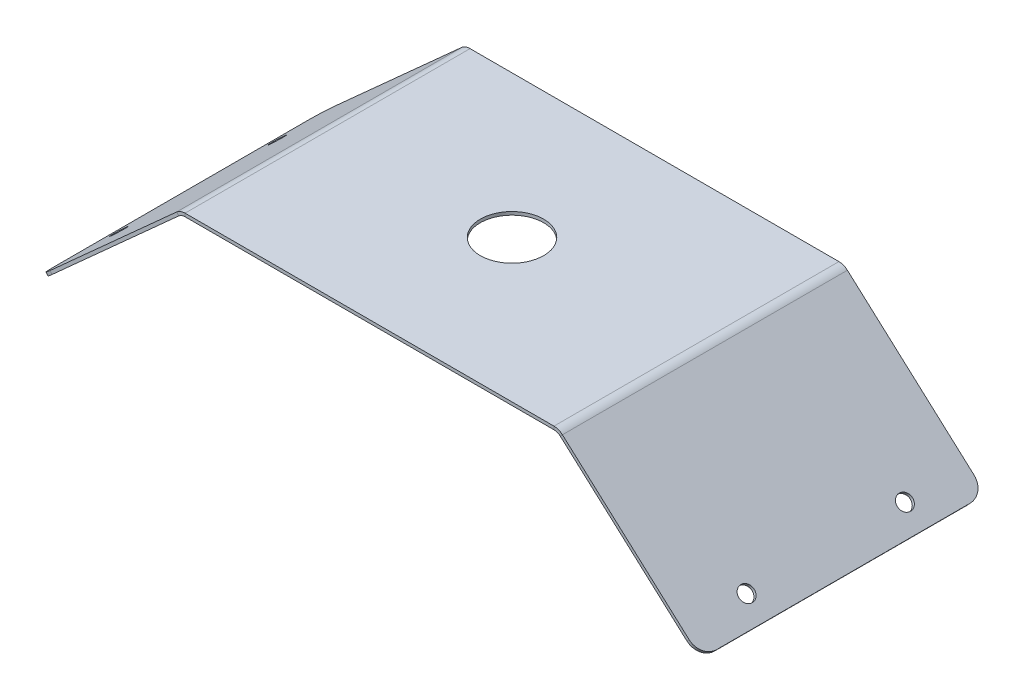
ISO-10303-21;
HEADER;
FILE_DESCRIPTION(('STEP AP214'),'2;1');
FILE_NAME('part.step','',(''),(''),'','','');
FILE_SCHEMA(('AUTOMOTIVE_DESIGN { 1 0 10303 214 1 1 1 1 }'));
ENDSEC;
DATA;
#1=APPLICATION_CONTEXT('core data for automotive mechanical design processes');
#2=APPLICATION_PROTOCOL_DEFINITION('international standard','automotive_design',2000,#1);
#3=PRODUCT_CONTEXT('',#1,'mechanical');
#4=PRODUCT('Part','Part','',(#3));
#5=PRODUCT_RELATED_PRODUCT_CATEGORY('part','',(#4));
#6=PRODUCT_DEFINITION_FORMATION('','',#4);
#7=PRODUCT_DEFINITION_CONTEXT('part definition',#1,'design');
#8=PRODUCT_DEFINITION('design','',#6,#7);
#9=PRODUCT_DEFINITION_SHAPE('','',#8);
#10=(LENGTH_UNIT() NAMED_UNIT(*) SI_UNIT(.MILLI.,.METRE.));
#11=(NAMED_UNIT(*) PLANE_ANGLE_UNIT() SI_UNIT($,.RADIAN.));
#12=(NAMED_UNIT(*) SI_UNIT($,.STERADIAN.) SOLID_ANGLE_UNIT());
#13=UNCERTAINTY_MEASURE_WITH_UNIT(LENGTH_MEASURE(1.E-05),#10,'distance_accuracy_value','');
#14=(GEOMETRIC_REPRESENTATION_CONTEXT(3) GLOBAL_UNCERTAINTY_ASSIGNED_CONTEXT((#13)) GLOBAL_UNIT_ASSIGNED_CONTEXT((#10,
#11,#12)) REPRESENTATION_CONTEXT('',''));
#15=CARTESIAN_POINT('',(0.,0.,0.));
#16=DIRECTION('',(0.,0.,1.));
#17=DIRECTION('',(1.,0.,0.));
#18=AXIS2_PLACEMENT_3D('',#15,#16,#17);
#19=CARTESIAN_POINT('',(-27.4040702711102,29.1563307964445,0.));
#20=DIRECTION('',(0.669130606358854,-0.743144825477398,0.));
#21=DIRECTION('',(0.743144825477398,0.669130606358854,0.));
#22=AXIS2_PLACEMENT_3D('',#19,#20,#21);
#23=PLANE('',#22);
#24=CARTESIAN_POINT('',(-99.0858260490285,-35.3862120083625,25.));
#25=DIRECTION('',(0.669130606358854,-0.743144825477398,0.));
#26=DIRECTION('',(0.743144825477398,0.669130606358854,0.));
#27=AXIS2_PLACEMENT_3D('',#24,#25,#26);
#28=CIRCLE('',#27,2.39999999999999);
#29=CARTESIAN_POINT('',(-100.869373630174,-36.9921254636237,25.));
#30=VERTEX_POINT('',#29);
#31=EDGE_CURVE('E741',#30,#30,#28,.T.);
#32=ORIENTED_EDGE('',*,*,#31,.T.);
#33=EDGE_LOOP('',(#32));
#34=FACE_BOUND('',#33,.T.);
#35=DIRECTION('',(-0.743144825477398,-0.669130606358854,0.));
#36=VECTOR('',#35,1.);
#37=CARTESIAN_POINT('',(-27.4040702711102,29.1563307964445,-45.));
#38=LINE('',#37,#36);
#39=CARTESIAN_POINT('',(-60.9265224254354,-1.02742069809042,-45.));
#40=VERTEX_POINT('',#39);
#41=CARTESIAN_POINT('',(-100.943688112722,-37.0590385242596,-45.));
#42=VERTEX_POINT('',#41);
#43=EDGE_CURVE('E214',#40,#42,#38,.T.);
#44=ORIENTED_EDGE('',*,*,#43,.T.);
#45=CARTESIAN_POINT('',(-100.943688112722,-37.0590385242596,-40.));
#46=DIRECTION('',(0.669130606358854,-0.743144825477398,0.));
#47=DIRECTION('',(0.743144825477398,0.669130606358854,0.));
#48=AXIS2_PLACEMENT_3D('',#45,#46,#47);
#49=CIRCLE('',#48,5.);
#50=CARTESIAN_POINT('',(-104.659412240109,-40.4046915560539,-40.));
#51=VERTEX_POINT('',#50);
#52=EDGE_CURVE('E83',#42,#51,#49,.F.);
#53=ORIENTED_EDGE('',*,*,#52,.T.);
#54=DIRECTION('',(0.,0.,1.));
#55=VECTOR('',#54,1.);
#56=CARTESIAN_POINT('',(-104.659412240109,-40.4046915560539,0.));
#57=LINE('',#56,#55);
#58=CARTESIAN_POINT('',(-104.659412240109,-40.4046915560539,40.));
#59=VERTEX_POINT('',#58);
#60=EDGE_CURVE('E220',#51,#59,#57,.T.);
#61=ORIENTED_EDGE('',*,*,#60,.T.);
#62=CARTESIAN_POINT('',(-100.943688112722,-37.0590385242596,40.));
#63=DIRECTION('',(0.669130606358854,-0.743144825477398,0.));
#64=DIRECTION('',(0.743144825477398,0.669130606358854,0.));
#65=AXIS2_PLACEMENT_3D('',#62,#63,#64);
#66=CIRCLE('',#65,5.);
#67=CARTESIAN_POINT('',(-100.943688112722,-37.0590385242596,45.));
#68=VERTEX_POINT('',#67);
#69=EDGE_CURVE('E90',#59,#68,#66,.F.);
#70=ORIENTED_EDGE('',*,*,#69,.T.);
#71=DIRECTION('',(0.743144825477398,0.669130606358854,0.));
#72=VECTOR('',#71,1.);
#73=CARTESIAN_POINT('',(-27.4040702711102,29.1563307964445,45.));
#74=LINE('',#73,#72);
#75=CARTESIAN_POINT('',(-60.9265224254354,-1.02742069809042,45.));
#76=VERTEX_POINT('',#75);
#77=EDGE_CURVE('E216',#68,#76,#74,.T.);
#78=ORIENTED_EDGE('',*,*,#77,.T.);
#79=DIRECTION('',(0.,0.,-1.));
#80=VECTOR('',#79,1.);
#81=CARTESIAN_POINT('',(-60.9265224254354,-1.02742069809041,45.));
#82=LINE('',#81,#80);
#83=EDGE_CURVE('E195',#40,#76,#82,.F.);
#84=ORIENTED_EDGE('',*,*,#83,.F.);
#85=EDGE_LOOP('',(#44,#53,#61,#70,#78,#84));
#86=FACE_BOUND('',#85,.T.);
#87=CARTESIAN_POINT('',(-99.0858260490285,-35.3862120083625,-25.));
#88=DIRECTION('',(0.669130606358854,-0.743144825477398,0.));
#89=DIRECTION('',(0.743144825477398,0.669130606358854,0.));
#90=AXIS2_PLACEMENT_3D('',#87,#88,#89);
#91=CIRCLE('',#90,2.39999999999999);
#92=CARTESIAN_POINT('',(-100.869373630174,-36.9921254636237,-25.));
#93=VERTEX_POINT('',#92);
#94=EDGE_CURVE('E730',#93,#93,#91,.T.);
#95=ORIENTED_EDGE('',*,*,#94,.T.);
#96=EDGE_LOOP('',(#95));
#97=FACE_BOUND('',#96,.T.);
#98=ADVANCED_FACE('F75',(#34,#86,#97),#23,.F.);
#99=CARTESIAN_POINT('',(-26.7349396647514,28.4131859709671,0.));
#100=DIRECTION('',(0.669130606358854,-0.743144825477398,0.));
#101=DIRECTION('',(0.743144825477398,0.669130606358854,0.));
#102=AXIS2_PLACEMENT_3D('',#99,#100,#101);
#103=PLANE('',#102);
#104=CARTESIAN_POINT('',(-98.4166954426696,-36.1293568338399,25.));
#105=DIRECTION('',(0.669130606358854,-0.743144825477398,0.));
#106=DIRECTION('',(0.743144825477398,0.669130606358854,0.));
#107=AXIS2_PLACEMENT_3D('',#104,#105,#106);
#108=CIRCLE('',#107,2.39999999999999);
#109=CARTESIAN_POINT('',(-100.200243023815,-37.7352702891011,25.));
#110=VERTEX_POINT('',#109);
#111=EDGE_CURVE('E743',#110,#110,#108,.T.);
#112=ORIENTED_EDGE('',*,*,#111,.F.);
#113=EDGE_LOOP('',(#112));
#114=FACE_BOUND('',#113,.T.);
#115=DIRECTION('',(0.,0.,-1.));
#116=VECTOR('',#115,1.);
#117=CARTESIAN_POINT('',(-103.99028163375,-41.1478363815313,45.));
#118=LINE('',#117,#116);
#119=CARTESIAN_POINT('',(-103.99028163375,-41.1478363815313,-40.));
#120=VERTEX_POINT('',#119);
#121=CARTESIAN_POINT('',(-103.99028163375,-41.1478363815313,40.));
#122=VERTEX_POINT('',#121);
#123=EDGE_CURVE('E224',#120,#122,#118,.F.);
#124=ORIENTED_EDGE('',*,*,#123,.F.);
#125=CARTESIAN_POINT('',(-100.274557506363,-37.802183349737,-40.));
#126=DIRECTION('',(0.669130606358854,-0.743144825477398,0.));
#127=DIRECTION('',(0.743144825477398,0.669130606358854,0.));
#128=AXIS2_PLACEMENT_3D('',#125,#126,#127);
#129=CIRCLE('',#128,5.);
#130=CARTESIAN_POINT('',(-100.274557506363,-37.802183349737,-45.));
#131=VERTEX_POINT('',#130);
#132=EDGE_CURVE('E335',#120,#131,#129,.T.);
#133=ORIENTED_EDGE('',*,*,#132,.T.);
#134=DIRECTION('',(0.743144825477398,0.669130606358854,0.));
#135=VECTOR('',#134,1.);
#136=CARTESIAN_POINT('',(-103.99028163375,-41.1478363815313,-45.));
#137=LINE('',#136,#135);
#138=CARTESIAN_POINT('',(-60.2573918190766,-1.77056552356784,-45.));
#139=VERTEX_POINT('',#138);
#140=EDGE_CURVE('E217',#139,#131,#137,.F.);
#141=ORIENTED_EDGE('',*,*,#140,.F.);
#142=DIRECTION('',(0.,0.,-1.));
#143=VECTOR('',#142,1.);
#144=CARTESIAN_POINT('',(-60.2573918190766,-1.77056552356781,45.));
#145=LINE('',#144,#143);
#146=CARTESIAN_POINT('',(-60.2573918190766,-1.77056552356781,45.));
#147=VERTEX_POINT('',#146);
#148=EDGE_CURVE('E211',#147,#139,#145,.T.);
#149=ORIENTED_EDGE('',*,*,#148,.F.);
#150=DIRECTION('',(-0.743144825477398,-0.669130606358854,0.));
#151=VECTOR('',#150,1.);
#152=CARTESIAN_POINT('',(-59.4015921051062,-1.00000000000001,45.));
#153=LINE('',#152,#151);
#154=CARTESIAN_POINT('',(-100.274557506363,-37.802183349737,45.));
#155=VERTEX_POINT('',#154);
#156=EDGE_CURVE('E221',#155,#147,#153,.F.);
#157=ORIENTED_EDGE('',*,*,#156,.F.);
#158=CARTESIAN_POINT('',(-100.274557506363,-37.802183349737,40.));
#159=DIRECTION('',(0.669130606358854,-0.743144825477398,0.));
#160=DIRECTION('',(0.743144825477398,0.669130606358854,0.));
#161=AXIS2_PLACEMENT_3D('',#158,#159,#160);
#162=CIRCLE('',#161,5.);
#163=EDGE_CURVE('E333',#155,#122,#162,.T.);
#164=ORIENTED_EDGE('',*,*,#163,.T.);
#165=EDGE_LOOP('',(#124,#133,#141,#149,#157,#164));
#166=FACE_BOUND('',#165,.T.);
#167=CARTESIAN_POINT('',(-98.4166954426696,-36.1293568338399,-25.));
#168=DIRECTION('',(0.669130606358854,-0.743144825477398,0.));
#169=DIRECTION('',(0.743144825477398,0.669130606358854,0.));
#170=AXIS2_PLACEMENT_3D('',#167,#168,#169);
#171=CIRCLE('',#170,2.39999999999999);
#172=CARTESIAN_POINT('',(-100.200243023815,-37.7352702891011,-25.));
#173=VERTEX_POINT('',#172);
#174=EDGE_CURVE('E734',#173,#173,#171,.T.);
#175=ORIENTED_EDGE('',*,*,#174,.F.);
#176=EDGE_LOOP('',(#175));
#177=FACE_BOUND('',#176,.T.);
#178=ADVANCED_FACE('F347',(#114,#166,#177),#103,.T.);
#179=CARTESIAN_POINT('',(-58.25,-1.,45.));
#180=DIRECTION('',(0.,0.,1.));
#181=DIRECTION('',(1.,0.,0.));
#182=AXIS2_PLACEMENT_3D('',#179,#180,#181);
#183=PLANE('',#182);
#184=DIRECTION('',(1.,0.,0.));
#185=VECTOR('',#184,1.);
#186=CARTESIAN_POINT('',(-58.25,0.,45.));
#187=LINE('',#186,#185);
#188=CARTESIAN_POINT('',(-58.25,0.,45.));
#189=VERTEX_POINT('',#188);
#190=CARTESIAN_POINT('',(58.25,0.,45.));
#191=VERTEX_POINT('',#190);
#192=EDGE_CURVE('E283',#189,#191,#187,.T.);
#193=ORIENTED_EDGE('',*,*,#192,.F.);
#194=DIRECTION('',(0.,1.,0.));
#195=VECTOR('',#194,1.);
#196=CARTESIAN_POINT('',(-58.25,-1.,45.));
#197=LINE('',#196,#195);
#198=CARTESIAN_POINT('',(-58.25,-1.00000000000001,45.));
#199=VERTEX_POINT('',#198);
#200=EDGE_CURVE('E304',#199,#189,#197,.T.);
#201=ORIENTED_EDGE('',*,*,#200,.F.);
#202=DIRECTION('',(1.,0.,0.));
#203=VECTOR('',#202,1.);
#204=CARTESIAN_POINT('',(-58.25,-1.,45.));
#205=LINE('',#204,#203);
#206=CARTESIAN_POINT('',(58.25,-1.00000000000003,45.));
#207=VERTEX_POINT('',#206);
#208=EDGE_CURVE('E288',#199,#207,#205,.T.);
#209=ORIENTED_EDGE('',*,*,#208,.T.);
#210=DIRECTION('',(0.,1.,0.));
#211=VECTOR('',#210,1.);
#212=CARTESIAN_POINT('',(58.25,-1.,45.));
#213=LINE('',#212,#211);
#214=EDGE_CURVE('E300',#207,#191,#213,.T.);
#215=ORIENTED_EDGE('',*,*,#214,.T.);
#216=EDGE_LOOP('',(#193,#201,#209,#215));
#217=FACE_BOUND('',#216,.T.);
#218=ADVANCED_FACE('F366',(#217),#183,.T.);
#219=CARTESIAN_POINT('',(-58.25,-1.,-45.));
#220=DIRECTION('',(0.,0.,-1.));
#221=DIRECTION('',(-1.,0.,0.));
#222=AXIS2_PLACEMENT_3D('',#219,#220,#221);
#223=PLANE('',#222);
#224=DIRECTION('',(-1.,0.,0.));
#225=VECTOR('',#224,1.);
#226=CARTESIAN_POINT('',(-58.25,0.,-45.));
#227=LINE('',#226,#225);
#228=CARTESIAN_POINT('',(58.25,0.,-45.));
#229=VERTEX_POINT('',#228);
#230=CARTESIAN_POINT('',(-58.25,0.,-45.));
#231=VERTEX_POINT('',#230);
#232=EDGE_CURVE('E294',#229,#231,#227,.T.);
#233=ORIENTED_EDGE('',*,*,#232,.F.);
#234=DIRECTION('',(0.,1.,0.));
#235=VECTOR('',#234,1.);
#236=CARTESIAN_POINT('',(58.25,-1.,-45.));
#237=LINE('',#236,#235);
#238=CARTESIAN_POINT('',(58.25,-1.00000000000002,-44.9999999999999));
#239=VERTEX_POINT('',#238);
#240=EDGE_CURVE('E291',#239,#229,#237,.T.);
#241=ORIENTED_EDGE('',*,*,#240,.F.);
#242=DIRECTION('',(-1.,0.,0.));
#243=VECTOR('',#242,1.);
#244=CARTESIAN_POINT('',(-58.25,-1.,-45.));
#245=LINE('',#244,#243);
#246=CARTESIAN_POINT('',(-58.25,-1.00000000000004,-45.));
#247=VERTEX_POINT('',#246);
#248=EDGE_CURVE('E282',#239,#247,#245,.T.);
#249=ORIENTED_EDGE('',*,*,#248,.T.);
#250=DIRECTION('',(0.,1.,0.));
#251=VECTOR('',#250,1.);
#252=CARTESIAN_POINT('',(-58.25,-1.,-45.));
#253=LINE('',#252,#251);
#254=EDGE_CURVE('E307',#247,#231,#253,.T.);
#255=ORIENTED_EDGE('',*,*,#254,.T.);
#256=EDGE_LOOP('',(#233,#241,#249,#255));
#257=FACE_BOUND('',#256,.T.);
#258=ADVANCED_FACE('F382',(#257),#223,.T.);
#259=CARTESIAN_POINT('',(0.,-1.,0.));
#260=DIRECTION('',(0.,1.,0.));
#261=DIRECTION('',(0.,0.,1.));
#262=AXIS2_PLACEMENT_3D('',#259,#260,#261);
#263=PLANE('',#262);
#264=CARTESIAN_POINT('',(0.,-1.,0.));
#265=DIRECTION('',(0.,1.,0.));
#266=DIRECTION('',(0.,0.,1.));
#267=AXIS2_PLACEMENT_3D('',#264,#265,#266);
#268=CIRCLE('',#267,10.);
#269=CARTESIAN_POINT('',(0.,-1.,10.));
#270=VERTEX_POINT('',#269);
#271=EDGE_CURVE('E728',#270,#270,#268,.F.);
#272=ORIENTED_EDGE('',*,*,#271,.F.);
#273=EDGE_LOOP('',(#272));
#274=FACE_BOUND('',#273,.T.);
#275=DIRECTION('',(0.,0.,-1.));
#276=VECTOR('',#275,1.);
#277=CARTESIAN_POINT('',(58.25,-1.,-45.));
#278=LINE('',#277,#276);
#279=EDGE_CURVE('E280',#207,#239,#278,.T.);
#280=ORIENTED_EDGE('',*,*,#279,.F.);
#281=ORIENTED_EDGE('',*,*,#208,.F.);
#282=DIRECTION('',(0.,0.,1.));
#283=VECTOR('',#282,1.);
#284=CARTESIAN_POINT('',(-58.25,-1.,-45.));
#285=LINE('',#284,#283);
#286=EDGE_CURVE('E286',#247,#199,#285,.T.);
#287=ORIENTED_EDGE('',*,*,#286,.F.);
#288=ORIENTED_EDGE('',*,*,#248,.F.);
#289=EDGE_LOOP('',(#280,#281,#287,#288));
#290=FACE_BOUND('',#289,.T.);
#291=ADVANCED_FACE('F369',(#274,#290),#263,.F.);
#292=CARTESIAN_POINT('',(0.,0.,0.));
#293=DIRECTION('',(0.,1.,0.));
#294=DIRECTION('',(0.,0.,1.));
#295=AXIS2_PLACEMENT_3D('',#292,#293,#294);
#296=PLANE('',#295);
#297=CARTESIAN_POINT('',(0.,0.,0.));
#298=DIRECTION('',(0.,1.,0.));
#299=DIRECTION('',(0.,0.,1.));
#300=AXIS2_PLACEMENT_3D('',#297,#298,#299);
#301=CIRCLE('',#300,10.);
#302=CARTESIAN_POINT('',(0.,0.,10.));
#303=VERTEX_POINT('',#302);
#304=EDGE_CURVE('E731',#303,#303,#301,.T.);
#305=ORIENTED_EDGE('',*,*,#304,.F.);
#306=EDGE_LOOP('',(#305));
#307=FACE_BOUND('',#306,.T.);
#308=DIRECTION('',(0.,0.,-1.));
#309=VECTOR('',#308,1.);
#310=CARTESIAN_POINT('',(58.25,0.,-45.));
#311=LINE('',#310,#309);
#312=EDGE_CURVE('E271',#191,#229,#311,.T.);
#313=ORIENTED_EDGE('',*,*,#312,.T.);
#314=ORIENTED_EDGE('',*,*,#232,.T.);
#315=DIRECTION('',(0.,0.,1.));
#316=VECTOR('',#315,1.);
#317=CARTESIAN_POINT('',(-58.25,0.,-45.));
#318=LINE('',#317,#316);
#319=EDGE_CURVE('E198',#231,#189,#318,.T.);
#320=ORIENTED_EDGE('',*,*,#319,.T.);
#321=ORIENTED_EDGE('',*,*,#192,.T.);
#322=EDGE_LOOP('',(#313,#314,#320,#321));
#323=FACE_BOUND('',#322,.T.);
#324=ADVANCED_FACE('F384',(#307,#323),#296,.T.);
#325=CARTESIAN_POINT('',(58.25,-4.00000000000002,-44.9999999999999));
#326=DIRECTION('',(0.,0.,-1.));
#327=DIRECTION('',(0.,1.,0.));
#328=AXIS2_PLACEMENT_3D('',#325,#326,#327);
#329=PLANE('',#328);
#330=DIRECTION('',(-0.669130606358854,-0.743144825477398,0.));
#331=VECTOR('',#330,1.);
#332=CARTESIAN_POINT('',(60.9265224254354,-1.02742069809042,-45.));
#333=LINE('',#332,#331);
#334=CARTESIAN_POINT('',(60.2573918190766,-1.77056552356782,-44.9999999999999));
#335=VERTEX_POINT('',#334);
#336=CARTESIAN_POINT('',(60.9265224254355,-1.02742069809043,-44.9999999999999));
#337=VERTEX_POINT('',#336);
#338=EDGE_CURVE('E236',#335,#337,#333,.F.);
#339=ORIENTED_EDGE('',*,*,#338,.F.);
#340=CARTESIAN_POINT('',(58.25,-4.00000000000002,-44.9999999999999));
#341=DIRECTION('',(0.,0.,1.));
#342=DIRECTION('',(0.,-1.,0.));
#343=AXIS2_PLACEMENT_3D('',#340,#341,#342);
#344=CIRCLE('',#343,3.);
#345=EDGE_CURVE('E275',#239,#335,#344,.F.);
#346=ORIENTED_EDGE('',*,*,#345,.F.);
#347=ORIENTED_EDGE('',*,*,#240,.T.);
#348=CARTESIAN_POINT('',(58.25,-4.00000000000002,-44.9999999999999));
#349=DIRECTION('',(0.,0.,1.));
#350=DIRECTION('',(0.,-1.,0.));
#351=AXIS2_PLACEMENT_3D('',#348,#349,#350);
#352=CIRCLE('',#351,4.);
#353=EDGE_CURVE('E268',#229,#337,#352,.F.);
#354=ORIENTED_EDGE('',*,*,#353,.T.);
#355=EDGE_LOOP('',(#339,#346,#347,#354));
#356=FACE_BOUND('',#355,.T.);
#357=ADVANCED_FACE('F379',(#356),#329,.T.);
#358=CARTESIAN_POINT('',(58.25,-4.00000000000003,45.));
#359=DIRECTION('',(0.,0.,-1.));
#360=DIRECTION('',(0.,1.,0.));
#361=AXIS2_PLACEMENT_3D('',#358,#359,#360);
#362=PLANE('',#361);
#363=CARTESIAN_POINT('',(58.25,-4.00000000000003,45.));
#364=DIRECTION('',(0.,0.,1.));
#365=DIRECTION('',(0.,-1.,0.));
#366=AXIS2_PLACEMENT_3D('',#363,#364,#365);
#367=CIRCLE('',#366,3.);
#368=CARTESIAN_POINT('',(60.2573918190766,-1.77056552356783,45.));
#369=VERTEX_POINT('',#368);
#370=EDGE_CURVE('E243',#369,#207,#367,.T.);
#371=ORIENTED_EDGE('',*,*,#370,.F.);
#372=DIRECTION('',(-0.669130606358854,-0.743144825477398,0.));
#373=VECTOR('',#372,1.);
#374=CARTESIAN_POINT('',(60.2573918190766,-1.77056552356783,45.));
#375=LINE('',#374,#373);
#376=CARTESIAN_POINT('',(60.9265224254355,-1.02742069809043,45.));
#377=VERTEX_POINT('',#376);
#378=EDGE_CURVE('E261',#369,#377,#375,.F.);
#379=ORIENTED_EDGE('',*,*,#378,.T.);
#380=CARTESIAN_POINT('',(58.25,-4.00000000000003,45.));
#381=DIRECTION('',(0.,0.,1.));
#382=DIRECTION('',(0.,-1.,0.));
#383=AXIS2_PLACEMENT_3D('',#380,#381,#382);
#384=CIRCLE('',#383,4.);
#385=EDGE_CURVE('E272',#377,#191,#384,.T.);
#386=ORIENTED_EDGE('',*,*,#385,.T.);
#387=ORIENTED_EDGE('',*,*,#214,.F.);
#388=EDGE_LOOP('',(#371,#379,#386,#387));
#389=FACE_BOUND('',#388,.T.);
#390=ADVANCED_FACE('F388',(#389),#362,.F.);
#391=CARTESIAN_POINT('',(58.25,-4.00000000000003,45.));
#392=DIRECTION('',(0.,0.,1.));
#393=DIRECTION('',(0.669130606358854,0.743144825477398,0.));
#394=AXIS2_PLACEMENT_3D('',#391,#392,#393);
#395=CYLINDRICAL_SURFACE('',#394,4.);
#396=ORIENTED_EDGE('',*,*,#312,.F.);
#397=ORIENTED_EDGE('',*,*,#385,.F.);
#398=DIRECTION('',(0.,0.,1.));
#399=VECTOR('',#398,1.);
#400=CARTESIAN_POINT('',(60.9265224254354,-1.02742069809042,-45.));
#401=LINE('',#400,#399);
#402=EDGE_CURVE('E258',#377,#337,#401,.F.);
#403=ORIENTED_EDGE('',*,*,#402,.T.);
#404=ORIENTED_EDGE('',*,*,#353,.F.);
#405=EDGE_LOOP('',(#396,#397,#403,#404));
#406=FACE_BOUND('',#405,.T.);
#407=ADVANCED_FACE('F386',(#406),#395,.T.);
#408=CARTESIAN_POINT('',(58.25,-4.00000000000003,45.));
#409=DIRECTION('',(0.,0.,1.));
#410=DIRECTION('',(0.669130606358854,0.743144825477398,0.));
#411=AXIS2_PLACEMENT_3D('',#408,#409,#410);
#412=CYLINDRICAL_SURFACE('',#411,3.);
#413=ORIENTED_EDGE('',*,*,#279,.T.);
#414=ORIENTED_EDGE('',*,*,#345,.T.);
#415=DIRECTION('',(0.,0.,1.));
#416=VECTOR('',#415,1.);
#417=CARTESIAN_POINT('',(60.2573918190766,-1.77056552356782,-45.));
#418=LINE('',#417,#416);
#419=EDGE_CURVE('E264',#335,#369,#418,.T.);
#420=ORIENTED_EDGE('',*,*,#419,.T.);
#421=ORIENTED_EDGE('',*,*,#370,.T.);
#422=EDGE_LOOP('',(#413,#414,#420,#421));
#423=FACE_BOUND('',#422,.T.);
#424=ADVANCED_FACE('F373',(#423),#412,.F.);
#425=CARTESIAN_POINT('',(104.659412240109,-40.4046915560539,45.));
#426=DIRECTION('',(0.,0.,-1.));
#427=DIRECTION('',(-1.,0.,0.));
#428=AXIS2_PLACEMENT_3D('',#425,#426,#427);
#429=PLANE('',#428);
#430=DIRECTION('',(-0.743144825477398,0.669130606358854,0.));
#431=VECTOR('',#430,1.);
#432=CARTESIAN_POINT('',(103.99028163375,-41.1478363815313,45.));
#433=LINE('',#432,#431);
#434=CARTESIAN_POINT('',(100.274557506363,-37.802183349737,45.));
#435=VERTEX_POINT('',#434);
#436=EDGE_CURVE('E255',#369,#435,#433,.F.);
#437=ORIENTED_EDGE('',*,*,#436,.T.);
#438=DIRECTION('',(-0.669130606358854,-0.743144825477398,0.));
#439=VECTOR('',#438,1.);
#440=CARTESIAN_POINT('',(100.943688112722,-37.0590385242596,45.));
#441=LINE('',#440,#439);
#442=CARTESIAN_POINT('',(100.943688112722,-37.0590385242596,45.));
#443=VERTEX_POINT('',#442);
#444=EDGE_CURVE('E319',#435,#443,#441,.F.);
#445=ORIENTED_EDGE('',*,*,#444,.T.);
#446=DIRECTION('',(0.743144825477398,-0.669130606358854,0.));
#447=VECTOR('',#446,1.);
#448=CARTESIAN_POINT('',(27.4040702711102,29.1563307964445,45.));
#449=LINE('',#448,#447);
#450=EDGE_CURVE('E247',#377,#443,#449,.T.);
#451=ORIENTED_EDGE('',*,*,#450,.F.);
#452=ORIENTED_EDGE('',*,*,#378,.F.);
#453=EDGE_LOOP('',(#437,#445,#451,#452));
#454=FACE_BOUND('',#453,.T.);
#455=ADVANCED_FACE('F398',(#454),#429,.F.);
#456=CARTESIAN_POINT('',(60.0707227114651,-0.25685517452261,-45.));
#457=DIRECTION('',(0.,0.,1.));
#458=DIRECTION('',(0.,-1.,0.));
#459=AXIS2_PLACEMENT_3D('',#456,#457,#458);
#460=PLANE('',#459);
#461=DIRECTION('',(-0.743144825477398,0.669130606358854,0.));
#462=VECTOR('',#461,1.);
#463=CARTESIAN_POINT('',(27.4040702711102,29.1563307964445,-45.));
#464=LINE('',#463,#462);
#465=CARTESIAN_POINT('',(100.943688112722,-37.0590385242596,-45.));
#466=VERTEX_POINT('',#465);
#467=EDGE_CURVE('E241',#466,#337,#464,.T.);
#468=ORIENTED_EDGE('',*,*,#467,.F.);
#469=DIRECTION('',(-0.669130606358854,-0.743144825477398,0.));
#470=VECTOR('',#469,1.);
#471=CARTESIAN_POINT('',(100.943688112722,-37.0590385242596,-45.));
#472=LINE('',#471,#470);
#473=CARTESIAN_POINT('',(100.274557506363,-37.802183349737,-45.));
#474=VERTEX_POINT('',#473);
#475=EDGE_CURVE('E325',#466,#474,#472,.T.);
#476=ORIENTED_EDGE('',*,*,#475,.T.);
#477=DIRECTION('',(0.743144825477398,-0.669130606358854,0.));
#478=VECTOR('',#477,1.);
#479=CARTESIAN_POINT('',(59.4015921051063,-1.00000000000001,-45.));
#480=LINE('',#479,#478);
#481=EDGE_CURVE('E250',#474,#335,#480,.F.);
#482=ORIENTED_EDGE('',*,*,#481,.T.);
#483=ORIENTED_EDGE('',*,*,#338,.T.);
#484=EDGE_LOOP('',(#468,#476,#482,#483));
#485=FACE_BOUND('',#484,.T.);
#486=ADVANCED_FACE('F413',(#485),#460,.F.);
#487=CARTESIAN_POINT('',(27.4040702711102,29.1563307964445,0.));
#488=DIRECTION('',(-0.669130606358854,-0.743144825477398,0.));
#489=DIRECTION('',(0.743144825477398,-0.669130606358854,0.));
#490=AXIS2_PLACEMENT_3D('',#487,#488,#489);
#491=PLANE('',#490);
#492=CARTESIAN_POINT('',(99.0858260490285,-35.3862120083625,-25.));
#493=DIRECTION('',(0.669130606358854,0.743144825477398,0.));
#494=DIRECTION('',(-0.743144825477398,0.669130606358854,0.));
#495=AXIS2_PLACEMENT_3D('',#492,#493,#494);
#496=CIRCLE('',#495,2.39999999999999);
#497=CARTESIAN_POINT('',(97.3022784678827,-33.7802985531012,-25.));
#498=VERTEX_POINT('',#497);
#499=EDGE_CURVE('E747',#498,#498,#496,.T.);
#500=ORIENTED_EDGE('',*,*,#499,.F.);
#501=EDGE_LOOP('',(#500));
#502=FACE_BOUND('',#501,.T.);
#503=CARTESIAN_POINT('',(99.0858260490285,-35.3862120083625,25.));
#504=DIRECTION('',(0.669130606358854,0.743144825477398,0.));
#505=DIRECTION('',(-0.743144825477398,0.669130606358854,0.));
#506=AXIS2_PLACEMENT_3D('',#503,#504,#505);
#507=CIRCLE('',#506,2.39999999999999);
#508=CARTESIAN_POINT('',(97.3022784678827,-33.7802985531012,25.));
#509=VERTEX_POINT('',#508);
#510=EDGE_CURVE('E235',#509,#509,#507,.T.);
#511=ORIENTED_EDGE('',*,*,#510,.F.);
#512=EDGE_LOOP('',(#511));
#513=FACE_BOUND('',#512,.T.);
#514=ORIENTED_EDGE('',*,*,#450,.T.);
#515=CARTESIAN_POINT('',(100.943688112722,-37.0590385242596,40.));
#516=DIRECTION('',(-0.669130606358854,-0.743144825477398,0.));
#517=DIRECTION('',(0.743144825477398,-0.669130606358854,0.));
#518=AXIS2_PLACEMENT_3D('',#515,#516,#517);
#519=CIRCLE('',#518,5.);
#520=CARTESIAN_POINT('',(104.659412240109,-40.4046915560539,40.));
#521=VERTEX_POINT('',#520);
#522=EDGE_CURVE('E323',#443,#521,#519,.F.);
#523=ORIENTED_EDGE('',*,*,#522,.T.);
#524=DIRECTION('',(0.,0.,-1.));
#525=VECTOR('',#524,1.);
#526=CARTESIAN_POINT('',(104.659412240109,-40.4046915560539,0.));
#527=LINE('',#526,#525);
#528=CARTESIAN_POINT('',(104.659412240109,-40.4046915560539,-40.));
#529=VERTEX_POINT('',#528);
#530=EDGE_CURVE('E244',#521,#529,#527,.T.);
#531=ORIENTED_EDGE('',*,*,#530,.T.);
#532=CARTESIAN_POINT('',(100.943688112722,-37.0590385242596,-40.));
#533=DIRECTION('',(-0.669130606358854,-0.743144825477398,0.));
#534=DIRECTION('',(0.743144825477398,-0.669130606358854,0.));
#535=AXIS2_PLACEMENT_3D('',#532,#533,#534);
#536=CIRCLE('',#535,5.);
#537=EDGE_CURVE('E321',#529,#466,#536,.F.);
#538=ORIENTED_EDGE('',*,*,#537,.T.);
#539=ORIENTED_EDGE('',*,*,#467,.T.);
#540=ORIENTED_EDGE('',*,*,#402,.F.);
#541=EDGE_LOOP('',(#514,#523,#531,#538,#539,#540));
#542=FACE_BOUND('',#541,.T.);
#543=ADVANCED_FACE('F395',(#502,#513,#542),#491,.F.);
#544=CARTESIAN_POINT('',(26.7349396647514,28.4131859709671,0.));
#545=DIRECTION('',(-0.669130606358854,-0.743144825477398,0.));
#546=DIRECTION('',(0.743144825477398,-0.669130606358854,0.));
#547=AXIS2_PLACEMENT_3D('',#544,#545,#546);
#548=PLANE('',#547);
#549=CARTESIAN_POINT('',(98.4166954426696,-36.1293568338398,-25.));
#550=DIRECTION('',(-0.669130606358854,-0.743144825477398,0.));
#551=DIRECTION('',(0.743144825477398,-0.669130606358854,0.));
#552=AXIS2_PLACEMENT_3D('',#549,#550,#551);
#553=CIRCLE('',#552,2.39999999999999);
#554=CARTESIAN_POINT('',(100.200243023815,-37.7352702891011,-25.));
#555=VERTEX_POINT('',#554);
#556=EDGE_CURVE('E746',#555,#555,#553,.F.);
#557=ORIENTED_EDGE('',*,*,#556,.T.);
#558=EDGE_LOOP('',(#557));
#559=FACE_BOUND('',#558,.T.);
#560=CARTESIAN_POINT('',(98.4166954426696,-36.1293568338398,25.));
#561=DIRECTION('',(-0.669130606358854,-0.743144825477398,0.));
#562=DIRECTION('',(0.743144825477398,-0.669130606358854,0.));
#563=AXIS2_PLACEMENT_3D('',#560,#561,#562);
#564=CIRCLE('',#563,2.39999999999999);
#565=CARTESIAN_POINT('',(100.200243023815,-37.7352702891011,25.));
#566=VERTEX_POINT('',#565);
#567=EDGE_CURVE('E750',#566,#566,#564,.F.);
#568=ORIENTED_EDGE('',*,*,#567,.T.);
#569=EDGE_LOOP('',(#568));
#570=FACE_BOUND('',#569,.T.);
#571=DIRECTION('',(0.,0.,1.));
#572=VECTOR('',#571,1.);
#573=CARTESIAN_POINT('',(103.99028163375,-41.1478363815313,-45.));
#574=LINE('',#573,#572);
#575=CARTESIAN_POINT('',(103.99028163375,-41.1478363815313,40.));
#576=VERTEX_POINT('',#575);
#577=CARTESIAN_POINT('',(103.99028163375,-41.1478363815313,-40.));
#578=VERTEX_POINT('',#577);
#579=EDGE_CURVE('E252',#576,#578,#574,.F.);
#580=ORIENTED_EDGE('',*,*,#579,.F.);
#581=CARTESIAN_POINT('',(100.274557506363,-37.802183349737,40.));
#582=DIRECTION('',(-0.669130606358854,-0.743144825477398,0.));
#583=DIRECTION('',(0.743144825477398,-0.669130606358854,0.));
#584=AXIS2_PLACEMENT_3D('',#581,#582,#583);
#585=CIRCLE('',#584,5.);
#586=EDGE_CURVE('E317',#576,#435,#585,.T.);
#587=ORIENTED_EDGE('',*,*,#586,.T.);
#588=ORIENTED_EDGE('',*,*,#436,.F.);
#589=ORIENTED_EDGE('',*,*,#419,.F.);
#590=ORIENTED_EDGE('',*,*,#481,.F.);
#591=CARTESIAN_POINT('',(100.274557506363,-37.802183349737,-40.));
#592=DIRECTION('',(-0.669130606358854,-0.743144825477398,0.));
#593=DIRECTION('',(0.743144825477398,-0.669130606358854,0.));
#594=AXIS2_PLACEMENT_3D('',#591,#592,#593);
#595=CIRCLE('',#594,5.);
#596=EDGE_CURVE('E315',#474,#578,#595,.T.);
#597=ORIENTED_EDGE('',*,*,#596,.T.);
#598=EDGE_LOOP('',(#580,#587,#588,#589,#590,#597));
#599=FACE_BOUND('',#598,.T.);
#600=ADVANCED_FACE('F416',(#559,#570,#599),#548,.T.);
#601=CARTESIAN_POINT('',(104.659412240109,-40.4046915560539,-45.));
#602=DIRECTION('',(-0.743144825477398,0.669130606358854,0.));
#603=DIRECTION('',(-0.669130606358854,-0.743144825477398,0.));
#604=AXIS2_PLACEMENT_3D('',#601,#602,#603);
#605=PLANE('',#604);
#606=ORIENTED_EDGE('',*,*,#530,.F.);
#607=DIRECTION('',(-0.669130606358854,-0.743144825477398,0.));
#608=VECTOR('',#607,1.);
#609=CARTESIAN_POINT('',(104.659412240109,-40.4046915560539,40.));
#610=LINE('',#609,#608);
#611=EDGE_CURVE('E312',#521,#576,#610,.T.);
#612=ORIENTED_EDGE('',*,*,#611,.T.);
#613=ORIENTED_EDGE('',*,*,#579,.T.);
#614=DIRECTION('',(-0.669130606358854,-0.743144825477398,0.));
#615=VECTOR('',#614,1.);
#616=CARTESIAN_POINT('',(104.659412240109,-40.4046915560539,-40.));
#617=LINE('',#616,#615);
#618=EDGE_CURVE('E303',#578,#529,#617,.F.);
#619=ORIENTED_EDGE('',*,*,#618,.T.);
#620=EDGE_LOOP('',(#606,#612,#613,#619));
#621=FACE_BOUND('',#620,.T.);
#622=ADVANCED_FACE('F406',(#621),#605,.F.);
#623=CARTESIAN_POINT('',(-58.25,-4.,45.));
#624=DIRECTION('',(0.,0.,1.));
#625=DIRECTION('',(0.,-1.,0.));
#626=AXIS2_PLACEMENT_3D('',#623,#624,#625);
#627=PLANE('',#626);
#628=DIRECTION('',(0.669130606358854,-0.743144825477398,0.));
#629=VECTOR('',#628,1.);
#630=CARTESIAN_POINT('',(-60.9265224254354,-1.02742069809041,45.));
#631=LINE('',#630,#629);
#632=EDGE_CURVE('E232',#147,#76,#631,.F.);
#633=ORIENTED_EDGE('',*,*,#632,.F.);
#634=CARTESIAN_POINT('',(-58.25,-4.,45.));
#635=DIRECTION('',(0.,0.,-1.));
#636=DIRECTION('',(0.,1.,0.));
#637=AXIS2_PLACEMENT_3D('',#634,#635,#636);
#638=CIRCLE('',#637,2.99999999999998);
#639=EDGE_CURVE('E202',#199,#147,#638,.F.);
#640=ORIENTED_EDGE('',*,*,#639,.F.);
#641=ORIENTED_EDGE('',*,*,#200,.T.);
#642=CARTESIAN_POINT('',(-58.25,-4.,45.));
#643=DIRECTION('',(0.,0.,-1.));
#644=DIRECTION('',(0.,1.,0.));
#645=AXIS2_PLACEMENT_3D('',#642,#643,#644);
#646=CIRCLE('',#645,3.99999999999998);
#647=EDGE_CURVE('E201',#189,#76,#646,.F.);
#648=ORIENTED_EDGE('',*,*,#647,.T.);
#649=EDGE_LOOP('',(#633,#640,#641,#648));
#650=FACE_BOUND('',#649,.T.);
#651=ADVANCED_FACE('F362',(#650),#627,.T.);
#652=CARTESIAN_POINT('',(-58.25,-4.00000000000002,-45.));
#653=DIRECTION('',(0.,0.,1.));
#654=DIRECTION('',(0.,-1.,0.));
#655=AXIS2_PLACEMENT_3D('',#652,#653,#654);
#656=PLANE('',#655);
#657=CARTESIAN_POINT('',(-58.25,-4.00000000000002,-45.));
#658=DIRECTION('',(0.,0.,-1.));
#659=DIRECTION('',(0.,1.,0.));
#660=AXIS2_PLACEMENT_3D('',#657,#658,#659);
#661=CIRCLE('',#660,2.99999999999998);
#662=EDGE_CURVE('E209',#139,#247,#661,.T.);
#663=ORIENTED_EDGE('',*,*,#662,.F.);
#664=DIRECTION('',(0.669130606358854,-0.743144825477398,0.));
#665=VECTOR('',#664,1.);
#666=CARTESIAN_POINT('',(-60.2573918190766,-1.77056552356782,-45.));
#667=LINE('',#666,#665);
#668=EDGE_CURVE('E206',#139,#40,#667,.F.);
#669=ORIENTED_EDGE('',*,*,#668,.T.);
#670=CARTESIAN_POINT('',(-58.25,-4.00000000000002,-45.));
#671=DIRECTION('',(0.,0.,-1.));
#672=DIRECTION('',(0.,1.,0.));
#673=AXIS2_PLACEMENT_3D('',#670,#671,#672);
#674=CIRCLE('',#673,3.99999999999998);
#675=EDGE_CURVE('E191',#40,#231,#674,.T.);
#676=ORIENTED_EDGE('',*,*,#675,.T.);
#677=ORIENTED_EDGE('',*,*,#254,.F.);
#678=EDGE_LOOP('',(#663,#669,#676,#677));
#679=FACE_BOUND('',#678,.T.);
#680=ADVANCED_FACE('F207',(#679),#656,.F.);
#681=CARTESIAN_POINT('',(-58.25,-4.00000000000002,-45.));
#682=DIRECTION('',(0.,0.,-1.));
#683=DIRECTION('',(-0.669130606358854,0.743144825477398,0.));
#684=AXIS2_PLACEMENT_3D('',#681,#682,#683);
#685=CYLINDRICAL_SURFACE('',#684,3.99999999999998);
#686=ORIENTED_EDGE('',*,*,#319,.F.);
#687=ORIENTED_EDGE('',*,*,#675,.F.);
#688=ORIENTED_EDGE('',*,*,#83,.T.);
#689=ORIENTED_EDGE('',*,*,#647,.F.);
#690=EDGE_LOOP('',(#686,#687,#688,#689));
#691=FACE_BOUND('',#690,.T.);
#692=ADVANCED_FACE('F193',(#691),#685,.T.);
#693=CARTESIAN_POINT('',(-58.25,-4.00000000000002,-45.));
#694=DIRECTION('',(0.,0.,-1.));
#695=DIRECTION('',(-0.669130606358854,0.743144825477398,0.));
#696=AXIS2_PLACEMENT_3D('',#693,#694,#695);
#697=CYLINDRICAL_SURFACE('',#696,2.99999999999998);
#698=ORIENTED_EDGE('',*,*,#286,.T.);
#699=ORIENTED_EDGE('',*,*,#639,.T.);
#700=ORIENTED_EDGE('',*,*,#148,.T.);
#701=ORIENTED_EDGE('',*,*,#662,.T.);
#702=EDGE_LOOP('',(#698,#699,#700,#701));
#703=FACE_BOUND('',#702,.T.);
#704=ADVANCED_FACE('F357',(#703),#697,.F.);
#705=CARTESIAN_POINT('',(-104.659412240109,-40.4046915560539,-45.));
#706=DIRECTION('',(0.,0.,1.));
#707=DIRECTION('',(1.,0.,0.));
#708=AXIS2_PLACEMENT_3D('',#705,#706,#707);
#709=PLANE('',#708);
#710=ORIENTED_EDGE('',*,*,#140,.T.);
#711=DIRECTION('',(0.669130606358854,-0.743144825477398,0.));
#712=VECTOR('',#711,1.);
#713=CARTESIAN_POINT('',(-100.943688112722,-37.0590385242596,-45.));
#714=LINE('',#713,#712);
#715=EDGE_CURVE('E98',#131,#42,#714,.F.);
#716=ORIENTED_EDGE('',*,*,#715,.T.);
#717=ORIENTED_EDGE('',*,*,#43,.F.);
#718=ORIENTED_EDGE('',*,*,#668,.F.);
#719=EDGE_LOOP('',(#710,#716,#717,#718));
#720=FACE_BOUND('',#719,.T.);
#721=ADVANCED_FACE('F219',(#720),#709,.F.);
#722=CARTESIAN_POINT('',(-60.0707227114651,-0.25685517452261,45.));
#723=DIRECTION('',(0.,0.,-1.));
#724=DIRECTION('',(-1.,0.,0.));
#725=AXIS2_PLACEMENT_3D('',#722,#723,#724);
#726=PLANE('',#725);
#727=ORIENTED_EDGE('',*,*,#77,.F.);
#728=DIRECTION('',(0.669130606358854,-0.743144825477398,0.));
#729=VECTOR('',#728,1.);
#730=CARTESIAN_POINT('',(-100.943688112722,-37.0590385242596,45.));
#731=LINE('',#730,#729);
#732=EDGE_CURVE('E13',#68,#155,#731,.T.);
#733=ORIENTED_EDGE('',*,*,#732,.T.);
#734=ORIENTED_EDGE('',*,*,#156,.T.);
#735=ORIENTED_EDGE('',*,*,#632,.T.);
#736=EDGE_LOOP('',(#727,#733,#734,#735));
#737=FACE_BOUND('',#736,.T.);
#738=ADVANCED_FACE('F354',(#737),#726,.F.);
#739=CARTESIAN_POINT('',(-104.659412240109,-40.4046915560539,45.));
#740=DIRECTION('',(0.743144825477398,0.669130606358854,0.));
#741=DIRECTION('',(-0.669130606358854,0.743144825477398,0.));
#742=AXIS2_PLACEMENT_3D('',#739,#740,#741);
#743=PLANE('',#742);
#744=ORIENTED_EDGE('',*,*,#60,.F.);
#745=DIRECTION('',(0.669130606358854,-0.743144825477398,0.));
#746=VECTOR('',#745,1.);
#747=CARTESIAN_POINT('',(-104.659412240109,-40.4046915560539,-40.));
#748=LINE('',#747,#746);
#749=EDGE_CURVE('E330',#51,#120,#748,.T.);
#750=ORIENTED_EDGE('',*,*,#749,.T.);
#751=ORIENTED_EDGE('',*,*,#123,.T.);
#752=DIRECTION('',(0.669130606358854,-0.743144825477398,0.));
#753=VECTOR('',#752,1.);
#754=CARTESIAN_POINT('',(-104.659412240109,-40.4046915560539,40.));
#755=LINE('',#754,#753);
#756=EDGE_CURVE('E328',#122,#59,#755,.F.);
#757=ORIENTED_EDGE('',*,*,#756,.T.);
#758=EDGE_LOOP('',(#744,#750,#751,#757));
#759=FACE_BOUND('',#758,.T.);
#760=ADVANCED_FACE('F342',(#759),#743,.F.);
#761=CARTESIAN_POINT('',(4.99581943997553,-139.883750868739,25.));
#762=DIRECTION('',(0.669130606358854,0.743144825477398,0.));
#763=DIRECTION('',(-0.743144825477398,0.669130606358854,0.));
#764=AXIS2_PLACEMENT_3D('',#761,#762,#763);
#765=CYLINDRICAL_SURFACE('',#764,2.39999999999999);
#766=ORIENTED_EDGE('',*,*,#567,.F.);
#767=EDGE_LOOP('',(#766));
#768=FACE_BOUND('',#767,.T.);
#769=ORIENTED_EDGE('',*,*,#510,.T.);
#770=EDGE_LOOP('',(#769));
#771=FACE_BOUND('',#770,.T.);
#772=ADVANCED_FACE('F440',(#768,#771),#765,.F.);
#773=CARTESIAN_POINT('',(4.99581943997553,-139.883750868739,-25.));
#774=DIRECTION('',(0.669130606358854,0.743144825477398,0.));
#775=DIRECTION('',(-0.743144825477398,0.669130606358854,0.));
#776=AXIS2_PLACEMENT_3D('',#773,#774,#775);
#777=CYLINDRICAL_SURFACE('',#776,2.39999999999999);
#778=ORIENTED_EDGE('',*,*,#556,.F.);
#779=EDGE_LOOP('',(#778));
#780=FACE_BOUND('',#779,.T.);
#781=ORIENTED_EDGE('',*,*,#499,.T.);
#782=EDGE_LOOP('',(#781));
#783=FACE_BOUND('',#782,.T.);
#784=ADVANCED_FACE('F488',(#780,#783),#777,.F.);
#785=CARTESIAN_POINT('',(-4.99581943997551,-139.883750868739,25.));
#786=DIRECTION('',(-0.669130606358854,0.743144825477398,0.));
#787=DIRECTION('',(-0.743144825477398,-0.669130606358854,0.));
#788=AXIS2_PLACEMENT_3D('',#785,#786,#787);
#789=CYLINDRICAL_SURFACE('',#788,2.39999999999999);
#790=CARTESIAN_POINT('',(-100.200243023815,-37.7352702891011,25.));
#791=CARTESIAN_POINT('',(-100.207213134298,-37.7275291971691,25.));
#792=CARTESIAN_POINT('',(-100.214183244781,-37.719788105237,25.));
#793=CARTESIAN_POINT('',(-100.228123465747,-37.7043059213729,25.));
#794=CARTESIAN_POINT('',(-100.23509357623,-37.6965648294408,25.));
#795=CARTESIAN_POINT('',(-100.249033797196,-37.6810826455767,25.));
#796=CARTESIAN_POINT('',(-100.256003907679,-37.6733415536447,25.));
#797=CARTESIAN_POINT('',(-100.269944128644,-37.6578593697806,25.));
#798=CARTESIAN_POINT('',(-100.276914239127,-37.6501182778485,25.));
#799=CARTESIAN_POINT('',(-100.290854460093,-37.6346360939844,25.));
#800=CARTESIAN_POINT('',(-100.297824570576,-37.6268950020523,25.));
#801=CARTESIAN_POINT('',(-100.311764791542,-37.6114128181882,25.));
#802=CARTESIAN_POINT('',(-100.318734902025,-37.6036717262562,25.));
#803=CARTESIAN_POINT('',(-100.332675122991,-37.5881895423921,25.));
#804=CARTESIAN_POINT('',(-100.339645233473,-37.58044845046,25.));
#805=CARTESIAN_POINT('',(-100.353585454439,-37.5649662665959,25.));
#806=CARTESIAN_POINT('',(-100.360555564922,-37.5572251746638,25.));
#807=CARTESIAN_POINT('',(-100.374495785888,-37.5417429907997,25.));
#808=CARTESIAN_POINT('',(-100.381465896371,-37.5340018988677,25.));
#809=CARTESIAN_POINT('',(-100.395406117337,-37.5185197150035,25.));
#810=CARTESIAN_POINT('',(-100.40237622782,-37.5107786230715,25.));
#811=CARTESIAN_POINT('',(-100.416316448785,-37.4952964392074,25.));
#812=CARTESIAN_POINT('',(-100.423286559268,-37.4875553472753,25.));
#813=CARTESIAN_POINT('',(-100.437226780234,-37.4720731634112,25.));
#814=CARTESIAN_POINT('',(-100.444196890717,-37.4643320714791,25.));
#815=CARTESIAN_POINT('',(-100.458137111683,-37.448849887615,25.));
#816=CARTESIAN_POINT('',(-100.465107222166,-37.441108795683,25.));
#817=CARTESIAN_POINT('',(-100.479047443132,-37.4256266118189,25.));
#818=CARTESIAN_POINT('',(-100.486017553614,-37.4178855198868,25.));
#819=CARTESIAN_POINT('',(-100.49995777458,-37.4024033360227,25.));
#820=CARTESIAN_POINT('',(-100.506927885063,-37.3946622440907,25.));
#821=CARTESIAN_POINT('',(-100.520868106029,-37.3791800602266,25.));
#822=CARTESIAN_POINT('',(-100.527838216512,-37.3714389682945,25.));
#823=CARTESIAN_POINT('',(-100.541778437478,-37.3559567844304,25.));
#824=CARTESIAN_POINT('',(-100.548748547961,-37.3482156924983,25.));
#825=CARTESIAN_POINT('',(-100.562688768926,-37.3327335086342,25.));
#826=CARTESIAN_POINT('',(-100.569658879409,-37.3249924167021,25.));
#827=CARTESIAN_POINT('',(-100.583599100375,-37.309510232838,25.));
#828=CARTESIAN_POINT('',(-100.590569210858,-37.301769140906,25.));
#829=CARTESIAN_POINT('',(-100.604509431824,-37.2862869570419,25.));
#830=CARTESIAN_POINT('',(-100.611479542307,-37.2785458651098,25.));
#831=CARTESIAN_POINT('',(-100.625419763273,-37.2630636812457,25.));
#832=CARTESIAN_POINT('',(-100.632389873755,-37.2553225893136,25.));
#833=CARTESIAN_POINT('',(-100.646330094721,-37.2398404054495,25.));
#834=CARTESIAN_POINT('',(-100.653300205204,-37.2320993135175,25.));
#835=CARTESIAN_POINT('',(-100.66724042617,-37.2166171296534,25.));
#836=CARTESIAN_POINT('',(-100.674210536653,-37.2088760377213,25.));
#837=CARTESIAN_POINT('',(-100.688150757619,-37.1933938538572,25.));
#838=CARTESIAN_POINT('',(-100.695120868102,-37.1856527619251,25.));
#839=CARTESIAN_POINT('',(-100.709061089067,-37.170170578061,25.));
#840=CARTESIAN_POINT('',(-100.71603119955,-37.162429486129,25.));
#841=CARTESIAN_POINT('',(-100.729971420516,-37.1469473022648,25.));
#842=CARTESIAN_POINT('',(-100.736941530999,-37.1392062103328,25.));
#843=CARTESIAN_POINT('',(-100.750881751965,-37.1237240264687,25.));
#844=CARTESIAN_POINT('',(-100.757851862448,-37.1159829345366,25.));
#845=CARTESIAN_POINT('',(-100.771792083414,-37.1005007506725,25.));
#846=CARTESIAN_POINT('',(-100.778762193896,-37.0927596587404,25.));
#847=CARTESIAN_POINT('',(-100.792702414862,-37.0772774748763,25.));
#848=CARTESIAN_POINT('',(-100.799672525345,-37.0695363829443,25.));
#849=CARTESIAN_POINT('',(-100.813612746311,-37.0540541990802,25.));
#850=CARTESIAN_POINT('',(-100.820582856794,-37.0463131071481,25.));
#851=CARTESIAN_POINT('',(-100.83452307776,-37.030830923284,25.));
#852=CARTESIAN_POINT('',(-100.841493188243,-37.023089831352,25.));
#853=CARTESIAN_POINT('',(-100.855433409208,-37.0076076474878,25.));
#854=CARTESIAN_POINT('',(-100.862403519691,-36.9998665555558,25.));
#855=CARTESIAN_POINT('',(-100.869373630174,-36.9921254636237,25.));
#856=B_SPLINE_CURVE_WITH_KNOTS('',3,(#790,#791,#792,#793,#794,#795,#796,#797,#798,#799,#800,
#801,#802,#803,#804,#805,#806,#807,#808,#809,#810,#811,#812,#813,#814,#815,#816,#817,#818,#819,
#820,#821,#822,#823,#824,#825,#826,#827,#828,#829,#830,#831,#832,#833,#834,#835,#836,#837,#838,
#839,#840,#841,#842,#843,#844,#845,#846,#847,#848,#849,#850,#851,#852,#853,#854,#855),
.UNSPECIFIED.,.F.,.F.,(4,2,2,2,2,2,2,2,2,2,2,2,2,2,2,2,2,2,2,2,2,2,2,2,2,2,2,2,2,2,2,2,4),(0.,
0.0312499999999987,0.0624999999999881,0.093749999999996,0.124999999999975,0.156249999999984,
0.187500000000002,0.218749999999981,0.24999999999999,0.281250000000009,0.312499999999988,
0.343750000000006,0.375000000000005,0.406249999999984,0.437500000000002,0.468749999999981,
0.49999999999999,0.531250000000008,0.562499999999987,0.593749999999996,0.624999999999975,
0.656249999999994,0.687499999999992,0.718749999999982,0.74999999999999,0.781249999999999,
0.812499999999987,0.843749999999996,0.875000000000005,0.906249999999993,0.937500000000002,
0.968749999999982,1.),.UNSPECIFIED.);
#857=EDGE_CURVE('BSEAM495',#110,#30,#856,.T.);
#858=ORIENTED_EDGE('',*,*,#111,.T.);
#859=ORIENTED_EDGE('',*,*,#31,.F.);
#860=ORIENTED_EDGE('',*,*,#857,.T.);
#861=ORIENTED_EDGE('',*,*,#857,.F.);
#862=EDGE_LOOP('',(#858,#860,#859,#861));
#863=FACE_BOUND('',#862,.T.);
#864=ADVANCED_FACE('F495',(#863),#789,.F.);
#865=CARTESIAN_POINT('',(-4.99581943997551,-139.883750868739,-25.));
#866=DIRECTION('',(-0.669130606358854,0.743144825477398,0.));
#867=DIRECTION('',(-0.743144825477398,-0.669130606358854,0.));
#868=AXIS2_PLACEMENT_3D('',#865,#866,#867);
#869=CYLINDRICAL_SURFACE('',#868,2.39999999999999);
#870=CARTESIAN_POINT('',(-100.200243023815,-37.7352702891011,-25.));
#871=CARTESIAN_POINT('',(-100.207213134298,-37.7275291971691,-25.));
#872=CARTESIAN_POINT('',(-100.214183244781,-37.719788105237,-25.));
#873=CARTESIAN_POINT('',(-100.228123465747,-37.7043059213729,-25.));
#874=CARTESIAN_POINT('',(-100.23509357623,-37.6965648294408,-25.));
#875=CARTESIAN_POINT('',(-100.249033797196,-37.6810826455767,-25.));
#876=CARTESIAN_POINT('',(-100.256003907679,-37.6733415536447,-25.));
#877=CARTESIAN_POINT('',(-100.269944128644,-37.6578593697806,-25.));
#878=CARTESIAN_POINT('',(-100.276914239127,-37.6501182778485,-25.));
#879=CARTESIAN_POINT('',(-100.290854460093,-37.6346360939844,-25.));
#880=CARTESIAN_POINT('',(-100.297824570576,-37.6268950020523,-25.));
#881=CARTESIAN_POINT('',(-100.311764791542,-37.6114128181882,-25.));
#882=CARTESIAN_POINT('',(-100.318734902025,-37.6036717262562,-25.));
#883=CARTESIAN_POINT('',(-100.332675122991,-37.5881895423921,-25.));
#884=CARTESIAN_POINT('',(-100.339645233473,-37.58044845046,-25.));
#885=CARTESIAN_POINT('',(-100.353585454439,-37.5649662665959,-25.));
#886=CARTESIAN_POINT('',(-100.360555564922,-37.5572251746638,-25.));
#887=CARTESIAN_POINT('',(-100.374495785888,-37.5417429907997,-25.));
#888=CARTESIAN_POINT('',(-100.381465896371,-37.5340018988677,-25.));
#889=CARTESIAN_POINT('',(-100.395406117337,-37.5185197150035,-25.));
#890=CARTESIAN_POINT('',(-100.40237622782,-37.5107786230715,-25.));
#891=CARTESIAN_POINT('',(-100.416316448785,-37.4952964392074,-25.));
#892=CARTESIAN_POINT('',(-100.423286559268,-37.4875553472753,-25.));
#893=CARTESIAN_POINT('',(-100.437226780234,-37.4720731634112,-25.));
#894=CARTESIAN_POINT('',(-100.444196890717,-37.4643320714791,-25.));
#895=CARTESIAN_POINT('',(-100.458137111683,-37.448849887615,-25.));
#896=CARTESIAN_POINT('',(-100.465107222166,-37.441108795683,-25.));
#897=CARTESIAN_POINT('',(-100.479047443132,-37.4256266118189,-25.));
#898=CARTESIAN_POINT('',(-100.486017553614,-37.4178855198868,-25.));
#899=CARTESIAN_POINT('',(-100.49995777458,-37.4024033360227,-25.));
#900=CARTESIAN_POINT('',(-100.506927885063,-37.3946622440907,-25.));
#901=CARTESIAN_POINT('',(-100.520868106029,-37.3791800602266,-25.));
#902=CARTESIAN_POINT('',(-100.527838216512,-37.3714389682945,-25.));
#903=CARTESIAN_POINT('',(-100.541778437478,-37.3559567844304,-25.));
#904=CARTESIAN_POINT('',(-100.548748547961,-37.3482156924983,-25.));
#905=CARTESIAN_POINT('',(-100.562688768926,-37.3327335086342,-25.));
#906=CARTESIAN_POINT('',(-100.569658879409,-37.3249924167021,-25.));
#907=CARTESIAN_POINT('',(-100.583599100375,-37.309510232838,-25.));
#908=CARTESIAN_POINT('',(-100.590569210858,-37.301769140906,-25.));
#909=CARTESIAN_POINT('',(-100.604509431824,-37.2862869570419,-25.));
#910=CARTESIAN_POINT('',(-100.611479542307,-37.2785458651098,-25.));
#911=CARTESIAN_POINT('',(-100.625419763273,-37.2630636812457,-25.));
#912=CARTESIAN_POINT('',(-100.632389873755,-37.2553225893136,-25.));
#913=CARTESIAN_POINT('',(-100.646330094721,-37.2398404054495,-25.));
#914=CARTESIAN_POINT('',(-100.653300205204,-37.2320993135175,-25.));
#915=CARTESIAN_POINT('',(-100.66724042617,-37.2166171296534,-25.));
#916=CARTESIAN_POINT('',(-100.674210536653,-37.2088760377213,-25.));
#917=CARTESIAN_POINT('',(-100.688150757619,-37.1933938538572,-25.));
#918=CARTESIAN_POINT('',(-100.695120868102,-37.1856527619251,-25.));
#919=CARTESIAN_POINT('',(-100.709061089067,-37.170170578061,-25.));
#920=CARTESIAN_POINT('',(-100.71603119955,-37.162429486129,-25.));
#921=CARTESIAN_POINT('',(-100.729971420516,-37.1469473022648,-25.));
#922=CARTESIAN_POINT('',(-100.736941530999,-37.1392062103328,-25.));
#923=CARTESIAN_POINT('',(-100.750881751965,-37.1237240264687,-25.));
#924=CARTESIAN_POINT('',(-100.757851862448,-37.1159829345366,-25.));
#925=CARTESIAN_POINT('',(-100.771792083414,-37.1005007506725,-25.));
#926=CARTESIAN_POINT('',(-100.778762193896,-37.0927596587404,-25.));
#927=CARTESIAN_POINT('',(-100.792702414862,-37.0772774748763,-25.));
#928=CARTESIAN_POINT('',(-100.799672525345,-37.0695363829443,-25.));
#929=CARTESIAN_POINT('',(-100.813612746311,-37.0540541990802,-25.));
#930=CARTESIAN_POINT('',(-100.820582856794,-37.0463131071481,-25.));
#931=CARTESIAN_POINT('',(-100.83452307776,-37.030830923284,-25.));
#932=CARTESIAN_POINT('',(-100.841493188243,-37.023089831352,-25.));
#933=CARTESIAN_POINT('',(-100.855433409208,-37.0076076474878,-25.));
#934=CARTESIAN_POINT('',(-100.862403519691,-36.9998665555558,-25.));
#935=CARTESIAN_POINT('',(-100.869373630174,-36.9921254636237,-25.));
#936=B_SPLINE_CURVE_WITH_KNOTS('',3,(#870,#871,#872,#873,#874,#875,#876,#877,#878,#879,#880,
#881,#882,#883,#884,#885,#886,#887,#888,#889,#890,#891,#892,#893,#894,#895,#896,#897,#898,#899,
#900,#901,#902,#903,#904,#905,#906,#907,#908,#909,#910,#911,#912,#913,#914,#915,#916,#917,#918,
#919,#920,#921,#922,#923,#924,#925,#926,#927,#928,#929,#930,#931,#932,#933,#934,#935),
.UNSPECIFIED.,.F.,.F.,(4,2,2,2,2,2,2,2,2,2,2,2,2,2,2,2,2,2,2,2,2,2,2,2,2,2,2,2,2,2,2,2,4),(0.,
0.0312499999999987,0.0624999999999881,0.093749999999996,0.124999999999975,0.156249999999984,
0.187500000000002,0.218749999999981,0.24999999999999,0.281250000000009,0.312499999999988,
0.343750000000006,0.375000000000005,0.406249999999984,0.437500000000002,0.468749999999981,
0.49999999999999,0.531250000000008,0.562499999999987,0.593749999999996,0.624999999999975,
0.656249999999994,0.687499999999992,0.718749999999982,0.74999999999999,0.781249999999999,
0.812499999999987,0.843749999999996,0.875000000000005,0.906249999999993,0.937500000000002,
0.968749999999982,1.),.UNSPECIFIED.);
#937=EDGE_CURVE('BSEAM502',#173,#93,#936,.T.);
#938=ORIENTED_EDGE('',*,*,#174,.T.);
#939=ORIENTED_EDGE('',*,*,#94,.F.);
#940=ORIENTED_EDGE('',*,*,#937,.T.);
#941=ORIENTED_EDGE('',*,*,#937,.F.);
#942=EDGE_LOOP('',(#938,#940,#939,#941));
#943=FACE_BOUND('',#942,.T.);
#944=ADVANCED_FACE('F502',(#943),#869,.F.);
#945=CARTESIAN_POINT('',(100.943688112722,-37.0590385242596,40.));
#946=DIRECTION('',(-0.669130606358854,-0.743144825477398,0.));
#947=DIRECTION('',(0.743144825477398,-0.669130606358854,0.));
#948=AXIS2_PLACEMENT_3D('',#945,#946,#947);
#949=CYLINDRICAL_SURFACE('',#948,5.);
#950=ORIENTED_EDGE('',*,*,#522,.F.);
#951=ORIENTED_EDGE('',*,*,#444,.F.);
#952=ORIENTED_EDGE('',*,*,#586,.F.);
#953=ORIENTED_EDGE('',*,*,#611,.F.);
#954=EDGE_LOOP('',(#950,#951,#952,#953));
#955=FACE_BOUND('',#954,.T.);
#956=ADVANCED_FACE('F401',(#955),#949,.T.);
#957=CARTESIAN_POINT('',(100.943688112722,-37.0590385242596,-40.));
#958=DIRECTION('',(-0.669130606358854,-0.743144825477398,0.));
#959=DIRECTION('',(0.743144825477398,-0.669130606358854,0.));
#960=AXIS2_PLACEMENT_3D('',#957,#958,#959);
#961=CYLINDRICAL_SURFACE('',#960,5.);
#962=ORIENTED_EDGE('',*,*,#537,.F.);
#963=ORIENTED_EDGE('',*,*,#618,.F.);
#964=ORIENTED_EDGE('',*,*,#596,.F.);
#965=ORIENTED_EDGE('',*,*,#475,.F.);
#966=EDGE_LOOP('',(#962,#963,#964,#965));
#967=FACE_BOUND('',#966,.T.);
#968=ADVANCED_FACE('F410',(#967),#961,.T.);
#969=CARTESIAN_POINT('',(-100.943688112722,-37.0590385242596,-40.));
#970=DIRECTION('',(0.669130606358854,-0.743144825477398,0.));
#971=DIRECTION('',(0.743144825477398,0.669130606358854,0.));
#972=AXIS2_PLACEMENT_3D('',#969,#970,#971);
#973=CYLINDRICAL_SURFACE('',#972,5.);
#974=ORIENTED_EDGE('',*,*,#52,.F.);
#975=ORIENTED_EDGE('',*,*,#715,.F.);
#976=ORIENTED_EDGE('',*,*,#132,.F.);
#977=ORIENTED_EDGE('',*,*,#749,.F.);
#978=EDGE_LOOP('',(#974,#975,#976,#977));
#979=FACE_BOUND('',#978,.T.);
#980=ADVANCED_FACE('F345',(#979),#973,.T.);
#981=CARTESIAN_POINT('',(-100.943688112722,-37.0590385242596,40.));
#982=DIRECTION('',(0.669130606358854,-0.743144825477398,0.));
#983=DIRECTION('',(0.743144825477398,0.669130606358854,0.));
#984=AXIS2_PLACEMENT_3D('',#981,#982,#983);
#985=CYLINDRICAL_SURFACE('',#984,5.);
#986=ORIENTED_EDGE('',*,*,#69,.F.);
#987=ORIENTED_EDGE('',*,*,#756,.F.);
#988=ORIENTED_EDGE('',*,*,#163,.F.);
#989=ORIENTED_EDGE('',*,*,#732,.F.);
#990=EDGE_LOOP('',(#986,#987,#988,#989));
#991=FACE_BOUND('',#990,.T.);
#992=ADVANCED_FACE('F77',(#991),#985,.T.);
#993=CARTESIAN_POINT('',(0.,-41.1488363815313,0.));
#994=DIRECTION('',(0.,1.,0.));
#995=DIRECTION('',(0.,0.,1.));
#996=AXIS2_PLACEMENT_3D('',#993,#994,#995);
#997=CYLINDRICAL_SURFACE('',#996,10.);
#998=ORIENTED_EDGE('',*,*,#304,.T.);
#999=EDGE_LOOP('',(#998));
#1000=FACE_BOUND('',#999,.T.);
#1001=ORIENTED_EDGE('',*,*,#271,.T.);
#1002=EDGE_LOOP('',(#1001));
#1003=FACE_BOUND('',#1002,.T.);
#1004=ADVANCED_FACE('F533',(#1000,#1003),#997,.F.);
#1005=CLOSED_SHELL('',(#98,#178,#218,#258,#291,#324,#357,#390,#407,#424,#455,#486,#543,#600,
#622,#651,#680,#692,#704,#721,#738,#760,#772,#784,#864,#944,#956,#968,#980,#992,#1004));
#1006=MANIFOLD_SOLID_BREP('B2',#1005);
#1007=ADVANCED_BREP_SHAPE_REPRESENTATION('',(#18,#1006),#14);
#1008=SHAPE_DEFINITION_REPRESENTATION(#9,#1007);
ENDSEC;
END-ISO-10303-21;
